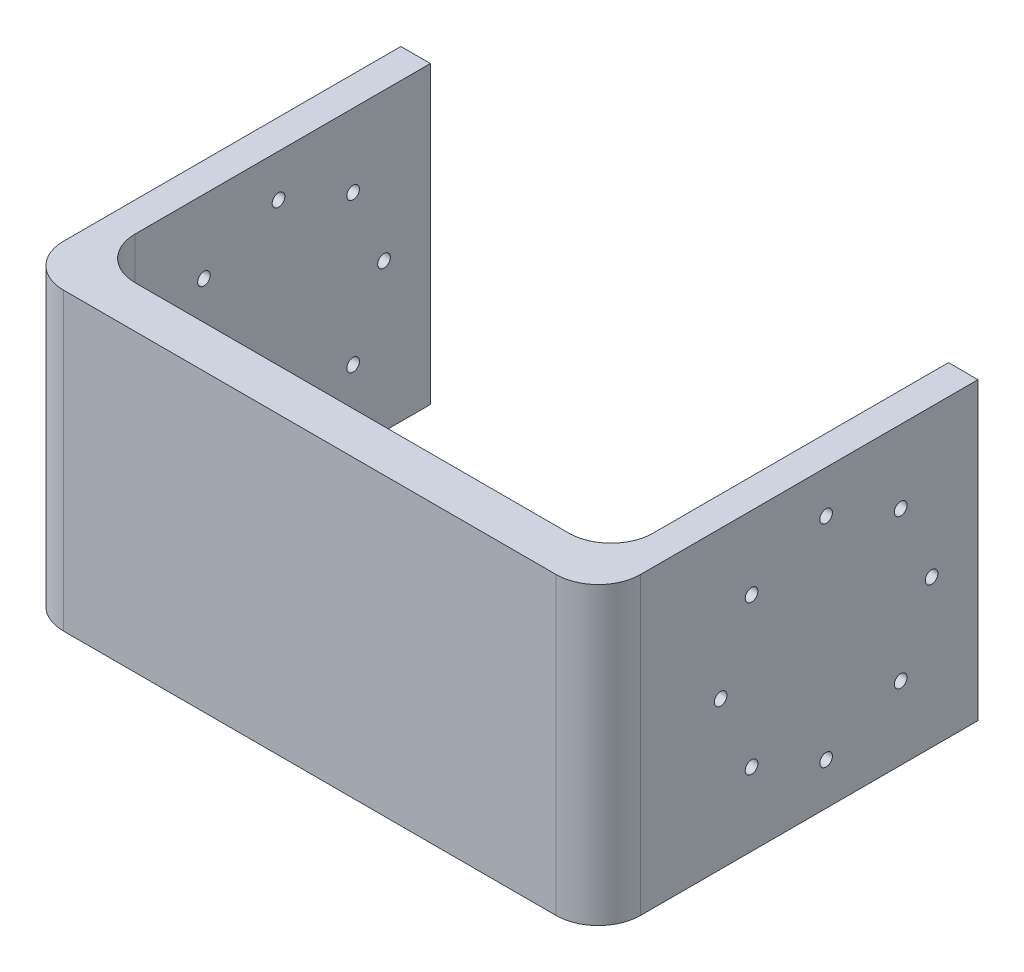
ISO-10303-21;
HEADER;
FILE_DESCRIPTION(('STEP AP214'),'2;1');
FILE_NAME('part.step','',(''),(''),'','','');
FILE_SCHEMA(('AUTOMOTIVE_DESIGN { 1 0 10303 214 1 1 1 1 }'));
ENDSEC;
DATA;
#1=APPLICATION_CONTEXT('core data for automotive mechanical design processes');
#2=APPLICATION_PROTOCOL_DEFINITION('international standard','automotive_design',2000,#1);
#3=PRODUCT_CONTEXT('',#1,'mechanical');
#4=PRODUCT('Part','Part','',(#3));
#5=PRODUCT_RELATED_PRODUCT_CATEGORY('part','',(#4));
#6=PRODUCT_DEFINITION_FORMATION('','',#4);
#7=PRODUCT_DEFINITION_CONTEXT('part definition',#1,'design');
#8=PRODUCT_DEFINITION('design','',#6,#7);
#9=PRODUCT_DEFINITION_SHAPE('','',#8);
#10=(LENGTH_UNIT() NAMED_UNIT(*) SI_UNIT(.MILLI.,.METRE.));
#11=(NAMED_UNIT(*) PLANE_ANGLE_UNIT() SI_UNIT($,.RADIAN.));
#12=(NAMED_UNIT(*) SI_UNIT($,.STERADIAN.) SOLID_ANGLE_UNIT());
#13=UNCERTAINTY_MEASURE_WITH_UNIT(LENGTH_MEASURE(1.E-05),#10,'distance_accuracy_value','');
#14=(GEOMETRIC_REPRESENTATION_CONTEXT(3) GLOBAL_UNCERTAINTY_ASSIGNED_CONTEXT((#13)) GLOBAL_UNIT_ASSIGNED_CONTEXT((#10,
#11,#12)) REPRESENTATION_CONTEXT('',''));
#15=CARTESIAN_POINT('',(0.,0.,0.));
#16=DIRECTION('',(0.,0.,1.));
#17=DIRECTION('',(1.,0.,0.));
#18=AXIS2_PLACEMENT_3D('',#15,#16,#17);
#19=CARTESIAN_POINT('',(34.2,17.5,-45.));
#20=DIRECTION('',(0.,0.,1.));
#21=DIRECTION('',(1.,0.,0.));
#22=AXIS2_PLACEMENT_3D('',#19,#20,#21);
#23=PLANE('',#22);
#24=DIRECTION('',(-1.,0.,0.));
#25=VECTOR('',#24,1.);
#26=CARTESIAN_POINT('',(34.2,-17.5,-45.));
#27=LINE('',#26,#25);
#28=CARTESIAN_POINT('',(34.2,-17.5,-45.));
#29=VERTEX_POINT('',#28);
#30=CARTESIAN_POINT('',(30.7,-17.5,-45.));
#31=VERTEX_POINT('',#30);
#32=EDGE_CURVE('E162',#29,#31,#27,.T.);
#33=ORIENTED_EDGE('',*,*,#32,.T.);
#34=DIRECTION('',(0.,-1.,0.));
#35=VECTOR('',#34,1.);
#36=CARTESIAN_POINT('',(30.7,17.5,-45.));
#37=LINE('',#36,#35);
#38=CARTESIAN_POINT('',(30.7,17.5,-45.));
#39=VERTEX_POINT('',#38);
#40=EDGE_CURVE('E12',#39,#31,#37,.T.);
#41=ORIENTED_EDGE('',*,*,#40,.F.);
#42=DIRECTION('',(-1.,0.,0.));
#43=VECTOR('',#42,1.);
#44=CARTESIAN_POINT('',(34.2,17.5,-45.));
#45=LINE('',#44,#43);
#46=CARTESIAN_POINT('',(34.2,17.5,-45.));
#47=VERTEX_POINT('',#46);
#48=EDGE_CURVE('E185',#47,#39,#45,.T.);
#49=ORIENTED_EDGE('',*,*,#48,.F.);
#50=DIRECTION('',(0.,-1.,0.));
#51=VECTOR('',#50,1.);
#52=CARTESIAN_POINT('',(34.2,17.5,-45.));
#53=LINE('',#52,#51);
#54=EDGE_CURVE('E158',#47,#29,#53,.T.);
#55=ORIENTED_EDGE('',*,*,#54,.T.);
#56=EDGE_LOOP('',(#33,#41,#49,#55));
#57=FACE_BOUND('',#56,.T.);
#58=ADVANCED_FACE('F42',(#57),#23,.F.);
#59=CARTESIAN_POINT('',(30.7,17.5,-10.));
#60=DIRECTION('',(1.,0.,0.));
#61=DIRECTION('',(0.,0.,-1.));
#62=AXIS2_PLACEMENT_3D('',#59,#60,#61);
#63=PLANE('',#62);
#64=CARTESIAN_POINT('',(30.7,-12.5,-27.));
#65=DIRECTION('',(1.,0.,0.));
#66=DIRECTION('',(0.,0.,-1.));
#67=AXIS2_PLACEMENT_3D('',#64,#65,#66);
#68=CIRCLE('',#67,0.750000000000002);
#69=CARTESIAN_POINT('',(30.7,-12.5,-27.75));
#70=VERTEX_POINT('',#69);
#71=EDGE_CURVE('E507',#70,#70,#68,.T.);
#72=ORIENTED_EDGE('',*,*,#71,.T.);
#73=EDGE_LOOP('',(#72));
#74=FACE_BOUND('',#73,.T.);
#75=CARTESIAN_POINT('',(30.7,12.5,-27.));
#76=DIRECTION('',(1.,0.,0.));
#77=DIRECTION('',(0.,0.,-1.));
#78=AXIS2_PLACEMENT_3D('',#75,#76,#77);
#79=CIRCLE('',#78,0.749999999999998);
#80=CARTESIAN_POINT('',(30.7,12.5,-27.75));
#81=VERTEX_POINT('',#80);
#82=EDGE_CURVE('E583',#81,#81,#79,.T.);
#83=ORIENTED_EDGE('',*,*,#82,.T.);
#84=EDGE_LOOP('',(#83));
#85=FACE_BOUND('',#84,.T.);
#86=CARTESIAN_POINT('',(30.7,8.83883476483184,-35.8388347648318));
#87=DIRECTION('',(1.,0.,0.));
#88=DIRECTION('',(0.,0.,-1.));
#89=AXIS2_PLACEMENT_3D('',#86,#87,#88);
#90=CIRCLE('',#89,0.749999999999999);
#91=CARTESIAN_POINT('',(30.7,8.83883476483184,-36.5888347648318));
#92=VERTEX_POINT('',#91);
#93=EDGE_CURVE('E577',#92,#92,#90,.T.);
#94=ORIENTED_EDGE('',*,*,#93,.T.);
#95=EDGE_LOOP('',(#94));
#96=FACE_BOUND('',#95,.T.);
#97=CARTESIAN_POINT('',(30.7,0.,-39.5));
#98=DIRECTION('',(1.,0.,0.));
#99=DIRECTION('',(0.,0.,-1.));
#100=AXIS2_PLACEMENT_3D('',#97,#98,#99);
#101=CIRCLE('',#100,0.749999999999999);
#102=CARTESIAN_POINT('',(30.7,0.,-40.25));
#103=VERTEX_POINT('',#102);
#104=EDGE_CURVE('E571',#103,#103,#101,.T.);
#105=ORIENTED_EDGE('',*,*,#104,.T.);
#106=EDGE_LOOP('',(#105));
#107=FACE_BOUND('',#106,.T.);
#108=CARTESIAN_POINT('',(30.7,-8.83883476483184,-35.8388347648318));
#109=DIRECTION('',(1.,0.,0.));
#110=DIRECTION('',(0.,0.,-1.));
#111=AXIS2_PLACEMENT_3D('',#108,#109,#110);
#112=CIRCLE('',#111,0.749999999999999);
#113=CARTESIAN_POINT('',(30.7,-8.83883476483184,-36.5888347648318));
#114=VERTEX_POINT('',#113);
#115=EDGE_CURVE('E565',#114,#114,#112,.T.);
#116=ORIENTED_EDGE('',*,*,#115,.T.);
#117=EDGE_LOOP('',(#116));
#118=FACE_BOUND('',#117,.T.);
#119=CARTESIAN_POINT('',(30.7,-8.83883476483185,-18.1611652351682));
#120=DIRECTION('',(1.,0.,0.));
#121=DIRECTION('',(0.,0.,-1.));
#122=AXIS2_PLACEMENT_3D('',#119,#120,#121);
#123=CIRCLE('',#122,0.749999999999998);
#124=CARTESIAN_POINT('',(30.7,-8.83883476483185,-18.9111652351682));
#125=VERTEX_POINT('',#124);
#126=EDGE_CURVE('E559',#125,#125,#123,.T.);
#127=ORIENTED_EDGE('',*,*,#126,.T.);
#128=EDGE_LOOP('',(#127));
#129=FACE_BOUND('',#128,.T.);
#130=CARTESIAN_POINT('',(30.7,0.,-14.5));
#131=DIRECTION('',(1.,0.,0.));
#132=DIRECTION('',(0.,0.,-1.));
#133=AXIS2_PLACEMENT_3D('',#130,#131,#132);
#134=CIRCLE('',#133,0.750000000000002);
#135=CARTESIAN_POINT('',(30.7,0.,-15.25));
#136=VERTEX_POINT('',#135);
#137=EDGE_CURVE('E553',#136,#136,#134,.T.);
#138=ORIENTED_EDGE('',*,*,#137,.T.);
#139=EDGE_LOOP('',(#138));
#140=FACE_BOUND('',#139,.T.);
#141=CARTESIAN_POINT('',(30.7,8.83883476483184,-18.1611652351681));
#142=DIRECTION('',(1.,0.,0.));
#143=DIRECTION('',(0.,0.,-1.));
#144=AXIS2_PLACEMENT_3D('',#141,#142,#143);
#145=CIRCLE('',#144,0.750000000000005);
#146=CARTESIAN_POINT('',(30.7,8.83883476483184,-18.9111652351682));
#147=VERTEX_POINT('',#146);
#148=EDGE_CURVE('E166',#147,#147,#145,.T.);
#149=ORIENTED_EDGE('',*,*,#148,.T.);
#150=EDGE_LOOP('',(#149));
#151=FACE_BOUND('',#150,.T.);
#152=DIRECTION('',(0.,0.,1.));
#153=VECTOR('',#152,1.);
#154=CARTESIAN_POINT('',(30.7,-17.5,-10.));
#155=LINE('',#154,#153);
#156=CARTESIAN_POINT('',(30.7,-17.5,-10.));
#157=VERTEX_POINT('',#156);
#158=EDGE_CURVE('E165',#31,#157,#155,.T.);
#159=ORIENTED_EDGE('',*,*,#158,.T.);
#160=DIRECTION('',(0.,-1.,0.));
#161=VECTOR('',#160,1.);
#162=CARTESIAN_POINT('',(30.7,17.5,-10.));
#163=LINE('',#162,#161);
#164=CARTESIAN_POINT('',(30.7,17.5,-10.));
#165=VERTEX_POINT('',#164);
#166=EDGE_CURVE('E50',#165,#157,#163,.T.);
#167=ORIENTED_EDGE('',*,*,#166,.F.);
#168=DIRECTION('',(0.,0.,1.));
#169=VECTOR('',#168,1.);
#170=CARTESIAN_POINT('',(30.7,17.5,-10.));
#171=LINE('',#170,#169);
#172=EDGE_CURVE('E113',#39,#165,#171,.T.);
#173=ORIENTED_EDGE('',*,*,#172,.F.);
#174=ORIENTED_EDGE('',*,*,#40,.T.);
#175=EDGE_LOOP('',(#159,#167,#173,#174));
#176=FACE_BOUND('',#175,.T.);
#177=ADVANCED_FACE('F266',(#74,#85,#96,#107,#118,#129,#140,#151,#176),#63,.F.);
#178=CARTESIAN_POINT('',(25.7,17.5,-10.));
#179=DIRECTION('',(0.,-1.,0.));
#180=DIRECTION('',(0.,0.,-1.));
#181=AXIS2_PLACEMENT_3D('',#178,#179,#180);
#182=CYLINDRICAL_SURFACE('',#181,5.);
#183=CARTESIAN_POINT('',(25.7,-17.5,-10.));
#184=DIRECTION('',(0.,-1.,0.));
#185=DIRECTION('',(0.,0.,1.));
#186=AXIS2_PLACEMENT_3D('',#183,#184,#185);
#187=CIRCLE('',#186,5.);
#188=CARTESIAN_POINT('',(25.7,-17.5,-5.));
#189=VERTEX_POINT('',#188);
#190=EDGE_CURVE('E168',#157,#189,#187,.T.);
#191=ORIENTED_EDGE('',*,*,#190,.T.);
#192=DIRECTION('',(0.,-1.,0.));
#193=VECTOR('',#192,1.);
#194=CARTESIAN_POINT('',(25.7,17.5,-5.));
#195=LINE('',#194,#193);
#196=CARTESIAN_POINT('',(25.7,17.5,-5.));
#197=VERTEX_POINT('',#196);
#198=EDGE_CURVE('E204',#197,#189,#195,.T.);
#199=ORIENTED_EDGE('',*,*,#198,.F.);
#200=CARTESIAN_POINT('',(25.7,17.5,-10.));
#201=DIRECTION('',(0.,-1.,0.));
#202=DIRECTION('',(0.,0.,1.));
#203=AXIS2_PLACEMENT_3D('',#200,#201,#202);
#204=CIRCLE('',#203,5.);
#205=EDGE_CURVE('E212',#165,#197,#204,.T.);
#206=ORIENTED_EDGE('',*,*,#205,.F.);
#207=ORIENTED_EDGE('',*,*,#166,.T.);
#208=EDGE_LOOP('',(#191,#199,#206,#207));
#209=FACE_BOUND('',#208,.T.);
#210=ADVANCED_FACE('F210',(#209),#182,.F.);
#211=CARTESIAN_POINT('',(-25.7,17.5,-5.));
#212=DIRECTION('',(0.,0.,1.));
#213=DIRECTION('',(1.,0.,0.));
#214=AXIS2_PLACEMENT_3D('',#211,#212,#213);
#215=PLANE('',#214);
#216=DIRECTION('',(-1.,0.,0.));
#217=VECTOR('',#216,1.);
#218=CARTESIAN_POINT('',(-25.7,-17.5,-5.));
#219=LINE('',#218,#217);
#220=CARTESIAN_POINT('',(-25.7,-17.5,-5.));
#221=VERTEX_POINT('',#220);
#222=EDGE_CURVE('E170',#189,#221,#219,.T.);
#223=ORIENTED_EDGE('',*,*,#222,.T.);
#224=DIRECTION('',(0.,-1.,0.));
#225=VECTOR('',#224,1.);
#226=CARTESIAN_POINT('',(-25.7,17.5,-5.));
#227=LINE('',#226,#225);
#228=CARTESIAN_POINT('',(-25.7,17.5,-5.));
#229=VERTEX_POINT('',#228);
#230=EDGE_CURVE('E201',#229,#221,#227,.T.);
#231=ORIENTED_EDGE('',*,*,#230,.F.);
#232=DIRECTION('',(-1.,0.,0.));
#233=VECTOR('',#232,1.);
#234=CARTESIAN_POINT('',(-25.7,17.5,-5.));
#235=LINE('',#234,#233);
#236=EDGE_CURVE('E230',#197,#229,#235,.T.);
#237=ORIENTED_EDGE('',*,*,#236,.F.);
#238=ORIENTED_EDGE('',*,*,#198,.T.);
#239=EDGE_LOOP('',(#223,#231,#237,#238));
#240=FACE_BOUND('',#239,.T.);
#241=ADVANCED_FACE('F221',(#240),#215,.F.);
#242=CARTESIAN_POINT('',(-25.7,17.5,-10.));
#243=DIRECTION('',(0.,-1.,0.));
#244=DIRECTION('',(0.,0.,-1.));
#245=AXIS2_PLACEMENT_3D('',#242,#243,#244);
#246=CYLINDRICAL_SURFACE('',#245,5.);
#247=CARTESIAN_POINT('',(-25.7,-17.5,-10.));
#248=DIRECTION('',(0.,-1.,0.));
#249=DIRECTION('',(0.,0.,1.));
#250=AXIS2_PLACEMENT_3D('',#247,#248,#249);
#251=CIRCLE('',#250,5.);
#252=CARTESIAN_POINT('',(-30.7,-17.5,-10.));
#253=VERTEX_POINT('',#252);
#254=EDGE_CURVE('E172',#221,#253,#251,.T.);
#255=ORIENTED_EDGE('',*,*,#254,.T.);
#256=DIRECTION('',(0.,-1.,0.));
#257=VECTOR('',#256,1.);
#258=CARTESIAN_POINT('',(-30.7,17.5,-10.));
#259=LINE('',#258,#257);
#260=CARTESIAN_POINT('',(-30.7,17.5,-10.));
#261=VERTEX_POINT('',#260);
#262=EDGE_CURVE('E198',#261,#253,#259,.T.);
#263=ORIENTED_EDGE('',*,*,#262,.F.);
#264=CARTESIAN_POINT('',(-25.7,17.5,-10.));
#265=DIRECTION('',(0.,-1.,0.));
#266=DIRECTION('',(0.,0.,1.));
#267=AXIS2_PLACEMENT_3D('',#264,#265,#266);
#268=CIRCLE('',#267,5.);
#269=EDGE_CURVE('E227',#229,#261,#268,.T.);
#270=ORIENTED_EDGE('',*,*,#269,.F.);
#271=ORIENTED_EDGE('',*,*,#230,.T.);
#272=EDGE_LOOP('',(#255,#263,#270,#271));
#273=FACE_BOUND('',#272,.T.);
#274=ADVANCED_FACE('F225',(#273),#246,.F.);
#275=CARTESIAN_POINT('',(-30.7,17.5,-45.));
#276=DIRECTION('',(-1.,0.,0.));
#277=DIRECTION('',(0.,0.,1.));
#278=AXIS2_PLACEMENT_3D('',#275,#276,#277);
#279=PLANE('',#278);
#280=CARTESIAN_POINT('',(-30.7,-12.5,-27.));
#281=DIRECTION('',(-1.,0.,0.));
#282=DIRECTION('',(0.,0.,1.));
#283=AXIS2_PLACEMENT_3D('',#280,#281,#282);
#284=CIRCLE('',#283,0.750000000000002);
#285=CARTESIAN_POINT('',(-30.7,-12.5,-26.25));
#286=VERTEX_POINT('',#285);
#287=EDGE_CURVE('E506',#286,#286,#284,.T.);
#288=ORIENTED_EDGE('',*,*,#287,.T.);
#289=EDGE_LOOP('',(#288));
#290=FACE_BOUND('',#289,.T.);
#291=CARTESIAN_POINT('',(-30.7,12.5,-27.));
#292=DIRECTION('',(-1.,0.,0.));
#293=DIRECTION('',(0.,0.,1.));
#294=AXIS2_PLACEMENT_3D('',#291,#292,#293);
#295=CIRCLE('',#294,0.749999999999998);
#296=CARTESIAN_POINT('',(-30.7,12.5,-26.25));
#297=VERTEX_POINT('',#296);
#298=EDGE_CURVE('E580',#297,#297,#295,.T.);
#299=ORIENTED_EDGE('',*,*,#298,.T.);
#300=EDGE_LOOP('',(#299));
#301=FACE_BOUND('',#300,.T.);
#302=CARTESIAN_POINT('',(-30.7,8.83883476483184,-35.8388347648318));
#303=DIRECTION('',(-1.,0.,0.));
#304=DIRECTION('',(0.,0.,1.));
#305=AXIS2_PLACEMENT_3D('',#302,#303,#304);
#306=CIRCLE('',#305,0.749999999999999);
#307=CARTESIAN_POINT('',(-30.7,8.83883476483184,-35.0888347648318));
#308=VERTEX_POINT('',#307);
#309=EDGE_CURVE('E574',#308,#308,#306,.T.);
#310=ORIENTED_EDGE('',*,*,#309,.T.);
#311=EDGE_LOOP('',(#310));
#312=FACE_BOUND('',#311,.T.);
#313=CARTESIAN_POINT('',(-30.7,0.,-39.5));
#314=DIRECTION('',(-1.,0.,0.));
#315=DIRECTION('',(0.,0.,1.));
#316=AXIS2_PLACEMENT_3D('',#313,#314,#315);
#317=CIRCLE('',#316,0.749999999999999);
#318=CARTESIAN_POINT('',(-30.7,0.,-38.75));
#319=VERTEX_POINT('',#318);
#320=EDGE_CURVE('E568',#319,#319,#317,.T.);
#321=ORIENTED_EDGE('',*,*,#320,.T.);
#322=EDGE_LOOP('',(#321));
#323=FACE_BOUND('',#322,.T.);
#324=CARTESIAN_POINT('',(-30.7,-8.83883476483184,-35.8388347648318));
#325=DIRECTION('',(-1.,0.,0.));
#326=DIRECTION('',(0.,0.,1.));
#327=AXIS2_PLACEMENT_3D('',#324,#325,#326);
#328=CIRCLE('',#327,0.749999999999999);
#329=CARTESIAN_POINT('',(-30.7,-8.83883476483184,-35.0888347648318));
#330=VERTEX_POINT('',#329);
#331=EDGE_CURVE('E562',#330,#330,#328,.T.);
#332=ORIENTED_EDGE('',*,*,#331,.T.);
#333=EDGE_LOOP('',(#332));
#334=FACE_BOUND('',#333,.T.);
#335=CARTESIAN_POINT('',(-30.7,-8.83883476483185,-18.1611652351682));
#336=DIRECTION('',(-1.,0.,0.));
#337=DIRECTION('',(0.,0.,1.));
#338=AXIS2_PLACEMENT_3D('',#335,#336,#337);
#339=CIRCLE('',#338,0.749999999999998);
#340=CARTESIAN_POINT('',(-30.7,-8.83883476483185,-17.4111652351682));
#341=VERTEX_POINT('',#340);
#342=EDGE_CURVE('E556',#341,#341,#339,.T.);
#343=ORIENTED_EDGE('',*,*,#342,.T.);
#344=EDGE_LOOP('',(#343));
#345=FACE_BOUND('',#344,.T.);
#346=CARTESIAN_POINT('',(-30.7,0.,-14.5));
#347=DIRECTION('',(-1.,0.,0.));
#348=DIRECTION('',(0.,0.,1.));
#349=AXIS2_PLACEMENT_3D('',#346,#347,#348);
#350=CIRCLE('',#349,0.750000000000002);
#351=CARTESIAN_POINT('',(-30.7,0.,-13.75));
#352=VERTEX_POINT('',#351);
#353=EDGE_CURVE('E540',#352,#352,#350,.T.);
#354=ORIENTED_EDGE('',*,*,#353,.T.);
#355=EDGE_LOOP('',(#354));
#356=FACE_BOUND('',#355,.T.);
#357=CARTESIAN_POINT('',(-30.7,8.83883476483184,-18.1611652351681));
#358=DIRECTION('',(-1.,0.,0.));
#359=DIRECTION('',(0.,0.,1.));
#360=AXIS2_PLACEMENT_3D('',#357,#358,#359);
#361=CIRCLE('',#360,0.750000000000005);
#362=CARTESIAN_POINT('',(-30.7,8.83883476483184,-17.4111652351681));
#363=VERTEX_POINT('',#362);
#364=EDGE_CURVE('E592',#363,#363,#361,.T.);
#365=ORIENTED_EDGE('',*,*,#364,.T.);
#366=EDGE_LOOP('',(#365));
#367=FACE_BOUND('',#366,.T.);
#368=DIRECTION('',(0.,0.,-1.));
#369=VECTOR('',#368,1.);
#370=CARTESIAN_POINT('',(-30.7,-17.5,-45.));
#371=LINE('',#370,#369);
#372=CARTESIAN_POINT('',(-30.7,-17.5,-45.));
#373=VERTEX_POINT('',#372);
#374=EDGE_CURVE('E174',#253,#373,#371,.T.);
#375=ORIENTED_EDGE('',*,*,#374,.T.);
#376=DIRECTION('',(0.,-1.,0.));
#377=VECTOR('',#376,1.);
#378=CARTESIAN_POINT('',(-30.7,17.5,-45.));
#379=LINE('',#378,#377);
#380=CARTESIAN_POINT('',(-30.7,17.5,-45.));
#381=VERTEX_POINT('',#380);
#382=EDGE_CURVE('E195',#381,#373,#379,.T.);
#383=ORIENTED_EDGE('',*,*,#382,.F.);
#384=DIRECTION('',(0.,0.,-1.));
#385=VECTOR('',#384,1.);
#386=CARTESIAN_POINT('',(-30.7,17.5,-45.));
#387=LINE('',#386,#385);
#388=EDGE_CURVE('E229',#261,#381,#387,.T.);
#389=ORIENTED_EDGE('',*,*,#388,.F.);
#390=ORIENTED_EDGE('',*,*,#262,.T.);
#391=EDGE_LOOP('',(#375,#383,#389,#390));
#392=FACE_BOUND('',#391,.T.);
#393=ADVANCED_FACE('F282',(#290,#301,#312,#323,#334,#345,#356,#367,#392),#279,.F.);
#394=CARTESIAN_POINT('',(-30.7,17.5,-45.));
#395=DIRECTION('',(0.,0.,1.));
#396=DIRECTION('',(1.,0.,0.));
#397=AXIS2_PLACEMENT_3D('',#394,#395,#396);
#398=PLANE('',#397);
#399=DIRECTION('',(-1.,0.,0.));
#400=VECTOR('',#399,1.);
#401=CARTESIAN_POINT('',(-30.7,-17.5,-45.));
#402=LINE('',#401,#400);
#403=CARTESIAN_POINT('',(-34.2,-17.5,-45.));
#404=VERTEX_POINT('',#403);
#405=EDGE_CURVE('E176',#373,#404,#402,.T.);
#406=ORIENTED_EDGE('',*,*,#405,.T.);
#407=DIRECTION('',(0.,-1.,0.));
#408=VECTOR('',#407,1.);
#409=CARTESIAN_POINT('',(-34.2,17.5,-45.));
#410=LINE('',#409,#408);
#411=CARTESIAN_POINT('',(-34.2,17.5,-45.));
#412=VERTEX_POINT('',#411);
#413=EDGE_CURVE('E192',#412,#404,#410,.T.);
#414=ORIENTED_EDGE('',*,*,#413,.F.);
#415=DIRECTION('',(-1.,0.,0.));
#416=VECTOR('',#415,1.);
#417=CARTESIAN_POINT('',(-30.7,17.5,-45.));
#418=LINE('',#417,#416);
#419=EDGE_CURVE('E232',#381,#412,#418,.T.);
#420=ORIENTED_EDGE('',*,*,#419,.F.);
#421=ORIENTED_EDGE('',*,*,#382,.T.);
#422=EDGE_LOOP('',(#406,#414,#420,#421));
#423=FACE_BOUND('',#422,.T.);
#424=ADVANCED_FACE('F285',(#423),#398,.F.);
#425=CARTESIAN_POINT('',(-34.2,17.5,-45.));
#426=DIRECTION('',(1.,0.,0.));
#427=DIRECTION('',(0.,0.,-1.));
#428=AXIS2_PLACEMENT_3D('',#425,#426,#427);
#429=PLANE('',#428);
#430=CARTESIAN_POINT('',(-34.2,-12.5,-27.));
#431=DIRECTION('',(-1.,0.,0.));
#432=DIRECTION('',(0.,0.,1.));
#433=AXIS2_PLACEMENT_3D('',#430,#431,#432);
#434=CIRCLE('',#433,0.750000000000002);
#435=CARTESIAN_POINT('',(-34.2,-12.5,-26.25));
#436=VERTEX_POINT('',#435);
#437=EDGE_CURVE('E503',#436,#436,#434,.T.);
#438=ORIENTED_EDGE('',*,*,#437,.F.);
#439=EDGE_LOOP('',(#438));
#440=FACE_BOUND('',#439,.T.);
#441=CARTESIAN_POINT('',(-34.2,12.5,-27.));
#442=DIRECTION('',(-1.,0.,0.));
#443=DIRECTION('',(0.,0.,1.));
#444=AXIS2_PLACEMENT_3D('',#441,#442,#443);
#445=CIRCLE('',#444,0.749999999999998);
#446=CARTESIAN_POINT('',(-34.2,12.5,-26.25));
#447=VERTEX_POINT('',#446);
#448=EDGE_CURVE('E526',#447,#447,#445,.T.);
#449=ORIENTED_EDGE('',*,*,#448,.F.);
#450=EDGE_LOOP('',(#449));
#451=FACE_BOUND('',#450,.T.);
#452=CARTESIAN_POINT('',(-34.2,8.83883476483184,-35.8388347648318));
#453=DIRECTION('',(-1.,0.,0.));
#454=DIRECTION('',(0.,0.,1.));
#455=AXIS2_PLACEMENT_3D('',#452,#453,#454);
#456=CIRCLE('',#455,0.749999999999999);
#457=CARTESIAN_POINT('',(-34.2,8.83883476483184,-35.0888347648318));
#458=VERTEX_POINT('',#457);
#459=EDGE_CURVE('E519',#458,#458,#456,.T.);
#460=ORIENTED_EDGE('',*,*,#459,.F.);
#461=EDGE_LOOP('',(#460));
#462=FACE_BOUND('',#461,.T.);
#463=CARTESIAN_POINT('',(-34.2,0.,-39.5));
#464=DIRECTION('',(-1.,0.,0.));
#465=DIRECTION('',(0.,0.,1.));
#466=AXIS2_PLACEMENT_3D('',#463,#464,#465);
#467=CIRCLE('',#466,0.749999999999999);
#468=CARTESIAN_POINT('',(-34.2,0.,-38.75));
#469=VERTEX_POINT('',#468);
#470=EDGE_CURVE('E518',#469,#469,#467,.T.);
#471=ORIENTED_EDGE('',*,*,#470,.F.);
#472=EDGE_LOOP('',(#471));
#473=FACE_BOUND('',#472,.T.);
#474=CARTESIAN_POINT('',(-34.2,-8.83883476483184,-35.8388347648318));
#475=DIRECTION('',(-1.,0.,0.));
#476=DIRECTION('',(0.,0.,1.));
#477=AXIS2_PLACEMENT_3D('',#474,#475,#476);
#478=CIRCLE('',#477,0.749999999999999);
#479=CARTESIAN_POINT('',(-34.2,-8.83883476483184,-35.0888347648318));
#480=VERTEX_POINT('',#479);
#481=EDGE_CURVE('E544',#480,#480,#478,.T.);
#482=ORIENTED_EDGE('',*,*,#481,.F.);
#483=EDGE_LOOP('',(#482));
#484=FACE_BOUND('',#483,.T.);
#485=CARTESIAN_POINT('',(-34.2,-8.83883476483185,-18.1611652351682));
#486=DIRECTION('',(-1.,0.,0.));
#487=DIRECTION('',(0.,0.,1.));
#488=AXIS2_PLACEMENT_3D('',#485,#486,#487);
#489=CIRCLE('',#488,0.749999999999998);
#490=CARTESIAN_POINT('',(-34.2,-8.83883476483185,-17.4111652351682));
#491=VERTEX_POINT('',#490);
#492=EDGE_CURVE('E537',#491,#491,#489,.T.);
#493=ORIENTED_EDGE('',*,*,#492,.F.);
#494=EDGE_LOOP('',(#493));
#495=FACE_BOUND('',#494,.T.);
#496=CARTESIAN_POINT('',(-34.2,0.,-14.5));
#497=DIRECTION('',(-1.,0.,0.));
#498=DIRECTION('',(0.,0.,1.));
#499=AXIS2_PLACEMENT_3D('',#496,#497,#498);
#500=CIRCLE('',#499,0.750000000000002);
#501=CARTESIAN_POINT('',(-34.2,0.,-13.75));
#502=VERTEX_POINT('',#501);
#503=EDGE_CURVE('E536',#502,#502,#500,.T.);
#504=ORIENTED_EDGE('',*,*,#503,.F.);
#505=EDGE_LOOP('',(#504));
#506=FACE_BOUND('',#505,.T.);
#507=CARTESIAN_POINT('',(-34.2,8.83883476483184,-18.1611652351681));
#508=DIRECTION('',(-1.,0.,0.));
#509=DIRECTION('',(0.,0.,1.));
#510=AXIS2_PLACEMENT_3D('',#507,#508,#509);
#511=CIRCLE('',#510,0.750000000000005);
#512=CARTESIAN_POINT('',(-34.2,8.83883476483184,-17.4111652351681));
#513=VERTEX_POINT('',#512);
#514=EDGE_CURVE('E586',#513,#513,#511,.T.);
#515=ORIENTED_EDGE('',*,*,#514,.F.);
#516=EDGE_LOOP('',(#515));
#517=FACE_BOUND('',#516,.T.);
#518=DIRECTION('',(0.,0.,1.));
#519=VECTOR('',#518,1.);
#520=CARTESIAN_POINT('',(-34.2,-17.5,-45.));
#521=LINE('',#520,#519);
#522=CARTESIAN_POINT('',(-34.2,-17.5,-5.));
#523=VERTEX_POINT('',#522);
#524=EDGE_CURVE('E178',#404,#523,#521,.T.);
#525=ORIENTED_EDGE('',*,*,#524,.T.);
#526=DIRECTION('',(0.,-1.,0.));
#527=VECTOR('',#526,1.);
#528=CARTESIAN_POINT('',(-34.2,17.5,-5.));
#529=LINE('',#528,#527);
#530=CARTESIAN_POINT('',(-34.2,17.5,-5.));
#531=VERTEX_POINT('',#530);
#532=EDGE_CURVE('E189',#531,#523,#529,.T.);
#533=ORIENTED_EDGE('',*,*,#532,.F.);
#534=DIRECTION('',(0.,0.,1.));
#535=VECTOR('',#534,1.);
#536=CARTESIAN_POINT('',(-34.2,17.5,-45.));
#537=LINE('',#536,#535);
#538=EDGE_CURVE('E238',#412,#531,#537,.T.);
#539=ORIENTED_EDGE('',*,*,#538,.F.);
#540=ORIENTED_EDGE('',*,*,#413,.T.);
#541=EDGE_LOOP('',(#525,#533,#539,#540));
#542=FACE_BOUND('',#541,.T.);
#543=ADVANCED_FACE('F244',(#440,#451,#462,#473,#484,#495,#506,#517,#542),#429,.F.);
#544=CARTESIAN_POINT('',(-29.2,17.5,-5.));
#545=DIRECTION('',(0.,-1.,0.));
#546=DIRECTION('',(0.,0.,-1.));
#547=AXIS2_PLACEMENT_3D('',#544,#545,#546);
#548=CYLINDRICAL_SURFACE('',#547,5.);
#549=CARTESIAN_POINT('',(-29.2,-17.5,-5.));
#550=DIRECTION('',(0.,1.,0.));
#551=DIRECTION('',(0.,0.,1.));
#552=AXIS2_PLACEMENT_3D('',#549,#550,#551);
#553=CIRCLE('',#552,5.);
#554=CARTESIAN_POINT('',(-29.2,-17.5,0.));
#555=VERTEX_POINT('',#554);
#556=EDGE_CURVE('E180',#523,#555,#553,.T.);
#557=ORIENTED_EDGE('',*,*,#556,.T.);
#558=DIRECTION('',(0.,-1.,0.));
#559=VECTOR('',#558,1.);
#560=CARTESIAN_POINT('',(-29.2,17.5,0.));
#561=LINE('',#560,#559);
#562=CARTESIAN_POINT('',(-29.2,17.5,0.));
#563=VERTEX_POINT('',#562);
#564=EDGE_CURVE('E153',#563,#555,#561,.T.);
#565=ORIENTED_EDGE('',*,*,#564,.F.);
#566=CARTESIAN_POINT('',(-29.2,17.5,-5.));
#567=DIRECTION('',(0.,1.,0.));
#568=DIRECTION('',(0.,0.,1.));
#569=AXIS2_PLACEMENT_3D('',#566,#567,#568);
#570=CIRCLE('',#569,5.);
#571=EDGE_CURVE('E144',#531,#563,#570,.T.);
#572=ORIENTED_EDGE('',*,*,#571,.F.);
#573=ORIENTED_EDGE('',*,*,#532,.T.);
#574=EDGE_LOOP('',(#557,#565,#572,#573));
#575=FACE_BOUND('',#574,.T.);
#576=ADVANCED_FACE('F248',(#575),#548,.T.);
#577=CARTESIAN_POINT('',(-29.2,17.5,0.));
#578=DIRECTION('',(0.,0.,-1.));
#579=DIRECTION('',(-1.,0.,0.));
#580=AXIS2_PLACEMENT_3D('',#577,#578,#579);
#581=PLANE('',#580);
#582=DIRECTION('',(1.,0.,0.));
#583=VECTOR('',#582,1.);
#584=CARTESIAN_POINT('',(-29.2,-17.5,0.));
#585=LINE('',#584,#583);
#586=CARTESIAN_POINT('',(29.2,-17.5,0.));
#587=VERTEX_POINT('',#586);
#588=EDGE_CURVE('E152',#555,#587,#585,.T.);
#589=ORIENTED_EDGE('',*,*,#588,.T.);
#590=DIRECTION('',(0.,-1.,0.));
#591=VECTOR('',#590,1.);
#592=CARTESIAN_POINT('',(29.2,17.5,0.));
#593=LINE('',#592,#591);
#594=CARTESIAN_POINT('',(29.2,17.5,0.));
#595=VERTEX_POINT('',#594);
#596=EDGE_CURVE('E149',#595,#587,#593,.T.);
#597=ORIENTED_EDGE('',*,*,#596,.F.);
#598=DIRECTION('',(1.,0.,0.));
#599=VECTOR('',#598,1.);
#600=CARTESIAN_POINT('',(-29.2,17.5,0.));
#601=LINE('',#600,#599);
#602=EDGE_CURVE('E138',#563,#595,#601,.T.);
#603=ORIENTED_EDGE('',*,*,#602,.F.);
#604=ORIENTED_EDGE('',*,*,#564,.T.);
#605=EDGE_LOOP('',(#589,#597,#603,#604));
#606=FACE_BOUND('',#605,.T.);
#607=ADVANCED_FACE('F150',(#606),#581,.F.);
#608=CARTESIAN_POINT('',(29.2,17.5,-5.));
#609=DIRECTION('',(0.,-1.,0.));
#610=DIRECTION('',(0.,0.,-1.));
#611=AXIS2_PLACEMENT_3D('',#608,#609,#610);
#612=CYLINDRICAL_SURFACE('',#611,5.);
#613=CARTESIAN_POINT('',(29.2,-17.5,-5.));
#614=DIRECTION('',(0.,1.,0.));
#615=DIRECTION('',(0.,0.,1.));
#616=AXIS2_PLACEMENT_3D('',#613,#614,#615);
#617=CIRCLE('',#616,5.);
#618=CARTESIAN_POINT('',(34.2,-17.5,-5.));
#619=VERTEX_POINT('',#618);
#620=EDGE_CURVE('E99',#587,#619,#617,.T.);
#621=ORIENTED_EDGE('',*,*,#620,.T.);
#622=DIRECTION('',(0.,-1.,0.));
#623=VECTOR('',#622,1.);
#624=CARTESIAN_POINT('',(34.2,17.5,-5.));
#625=LINE('',#624,#623);
#626=CARTESIAN_POINT('',(34.2,17.5,-5.));
#627=VERTEX_POINT('',#626);
#628=EDGE_CURVE('E154',#627,#619,#625,.T.);
#629=ORIENTED_EDGE('',*,*,#628,.F.);
#630=CARTESIAN_POINT('',(29.2,17.5,-5.));
#631=DIRECTION('',(0.,1.,0.));
#632=DIRECTION('',(0.,0.,1.));
#633=AXIS2_PLACEMENT_3D('',#630,#631,#632);
#634=CIRCLE('',#633,5.);
#635=EDGE_CURVE('E142',#595,#627,#634,.T.);
#636=ORIENTED_EDGE('',*,*,#635,.F.);
#637=ORIENTED_EDGE('',*,*,#596,.T.);
#638=EDGE_LOOP('',(#621,#629,#636,#637));
#639=FACE_BOUND('',#638,.T.);
#640=ADVANCED_FACE('F156',(#639),#612,.T.);
#641=CARTESIAN_POINT('',(34.2,17.5,-5.));
#642=DIRECTION('',(-1.,0.,0.));
#643=DIRECTION('',(0.,0.,1.));
#644=AXIS2_PLACEMENT_3D('',#641,#642,#643);
#645=PLANE('',#644);
#646=CARTESIAN_POINT('',(34.2,-12.5,-27.));
#647=DIRECTION('',(-1.,0.,0.));
#648=DIRECTION('',(0.,0.,1.));
#649=AXIS2_PLACEMENT_3D('',#646,#647,#648);
#650=CIRCLE('',#649,0.750000000000002);
#651=CARTESIAN_POINT('',(34.2,-12.5,-26.25));
#652=VERTEX_POINT('',#651);
#653=EDGE_CURVE('E508',#652,#652,#650,.T.);
#654=ORIENTED_EDGE('',*,*,#653,.T.);
#655=EDGE_LOOP('',(#654));
#656=FACE_BOUND('',#655,.T.);
#657=CARTESIAN_POINT('',(34.2,12.5,-27.));
#658=DIRECTION('',(-1.,0.,0.));
#659=DIRECTION('',(0.,0.,1.));
#660=AXIS2_PLACEMENT_3D('',#657,#658,#659);
#661=CIRCLE('',#660,0.749999999999998);
#662=CARTESIAN_POINT('',(34.2,12.5,-26.25));
#663=VERTEX_POINT('',#662);
#664=EDGE_CURVE('E510',#663,#663,#661,.F.);
#665=ORIENTED_EDGE('',*,*,#664,.F.);
#666=EDGE_LOOP('',(#665));
#667=FACE_BOUND('',#666,.T.);
#668=CARTESIAN_POINT('',(34.2,8.83883476483184,-35.8388347648318));
#669=DIRECTION('',(-1.,0.,0.));
#670=DIRECTION('',(0.,0.,1.));
#671=AXIS2_PLACEMENT_3D('',#668,#669,#670);
#672=CIRCLE('',#671,0.749999999999999);
#673=CARTESIAN_POINT('',(34.2,8.83883476483184,-35.0888347648318));
#674=VERTEX_POINT('',#673);
#675=EDGE_CURVE('E523',#674,#674,#672,.F.);
#676=ORIENTED_EDGE('',*,*,#675,.F.);
#677=EDGE_LOOP('',(#676));
#678=FACE_BOUND('',#677,.T.);
#679=CARTESIAN_POINT('',(34.2,0.,-39.5));
#680=DIRECTION('',(-1.,0.,0.));
#681=DIRECTION('',(0.,0.,1.));
#682=AXIS2_PLACEMENT_3D('',#679,#680,#681);
#683=CIRCLE('',#682,0.749999999999999);
#684=CARTESIAN_POINT('',(34.2,0.,-38.75));
#685=VERTEX_POINT('',#684);
#686=EDGE_CURVE('E515',#685,#685,#683,.F.);
#687=ORIENTED_EDGE('',*,*,#686,.F.);
#688=EDGE_LOOP('',(#687));
#689=FACE_BOUND('',#688,.T.);
#690=CARTESIAN_POINT('',(34.2,-8.83883476483184,-35.8388347648318));
#691=DIRECTION('',(-1.,0.,0.));
#692=DIRECTION('',(0.,0.,1.));
#693=AXIS2_PLACEMENT_3D('',#690,#691,#692);
#694=CIRCLE('',#693,0.749999999999999);
#695=CARTESIAN_POINT('',(34.2,-8.83883476483184,-35.0888347648318));
#696=VERTEX_POINT('',#695);
#697=EDGE_CURVE('E522',#696,#696,#694,.F.);
#698=ORIENTED_EDGE('',*,*,#697,.F.);
#699=EDGE_LOOP('',(#698));
#700=FACE_BOUND('',#699,.T.);
#701=CARTESIAN_POINT('',(34.2,-8.83883476483185,-18.1611652351682));
#702=DIRECTION('',(-1.,0.,0.));
#703=DIRECTION('',(0.,0.,1.));
#704=AXIS2_PLACEMENT_3D('',#701,#702,#703);
#705=CIRCLE('',#704,0.749999999999998);
#706=CARTESIAN_POINT('',(34.2,-8.83883476483185,-17.4111652351682));
#707=VERTEX_POINT('',#706);
#708=EDGE_CURVE('E541',#707,#707,#705,.F.);
#709=ORIENTED_EDGE('',*,*,#708,.F.);
#710=EDGE_LOOP('',(#709));
#711=FACE_BOUND('',#710,.T.);
#712=CARTESIAN_POINT('',(34.2,0.,-14.5));
#713=DIRECTION('',(-1.,0.,0.));
#714=DIRECTION('',(0.,0.,1.));
#715=AXIS2_PLACEMENT_3D('',#712,#713,#714);
#716=CIRCLE('',#715,0.750000000000002);
#717=CARTESIAN_POINT('',(34.2,0.,-13.75));
#718=VERTEX_POINT('',#717);
#719=EDGE_CURVE('E533',#718,#718,#716,.F.);
#720=ORIENTED_EDGE('',*,*,#719,.F.);
#721=EDGE_LOOP('',(#720));
#722=FACE_BOUND('',#721,.T.);
#723=CARTESIAN_POINT('',(34.2,8.83883476483184,-18.1611652351681));
#724=DIRECTION('',(-1.,0.,0.));
#725=DIRECTION('',(0.,0.,1.));
#726=AXIS2_PLACEMENT_3D('',#723,#724,#725);
#727=CIRCLE('',#726,0.750000000000005);
#728=CARTESIAN_POINT('',(34.2,8.83883476483184,-17.4111652351681));
#729=VERTEX_POINT('',#728);
#730=EDGE_CURVE('E589',#729,#729,#727,.F.);
#731=ORIENTED_EDGE('',*,*,#730,.F.);
#732=EDGE_LOOP('',(#731));
#733=FACE_BOUND('',#732,.T.);
#734=DIRECTION('',(0.,0.,-1.));
#735=VECTOR('',#734,1.);
#736=CARTESIAN_POINT('',(34.2,-17.5,-5.));
#737=LINE('',#736,#735);
#738=EDGE_CURVE('E105',#619,#29,#737,.T.);
#739=ORIENTED_EDGE('',*,*,#738,.T.);
#740=ORIENTED_EDGE('',*,*,#54,.F.);
#741=DIRECTION('',(0.,0.,-1.));
#742=VECTOR('',#741,1.);
#743=CARTESIAN_POINT('',(34.2,17.5,-5.));
#744=LINE('',#743,#742);
#745=EDGE_CURVE('E58',#627,#47,#744,.T.);
#746=ORIENTED_EDGE('',*,*,#745,.F.);
#747=ORIENTED_EDGE('',*,*,#628,.T.);
#748=EDGE_LOOP('',(#739,#740,#746,#747));
#749=FACE_BOUND('',#748,.T.);
#750=ADVANCED_FACE('F252',(#656,#667,#678,#689,#700,#711,#722,#733,#749),#645,.F.);
#751=CARTESIAN_POINT('',(25.7,17.5,-10.));
#752=DIRECTION('',(0.,1.,0.));
#753=DIRECTION('',(0.,0.,1.));
#754=AXIS2_PLACEMENT_3D('',#751,#752,#753);
#755=PLANE('',#754);
#756=ORIENTED_EDGE('',*,*,#48,.T.);
#757=ORIENTED_EDGE('',*,*,#172,.T.);
#758=ORIENTED_EDGE('',*,*,#205,.T.);
#759=ORIENTED_EDGE('',*,*,#236,.T.);
#760=ORIENTED_EDGE('',*,*,#269,.T.);
#761=ORIENTED_EDGE('',*,*,#388,.T.);
#762=ORIENTED_EDGE('',*,*,#419,.T.);
#763=ORIENTED_EDGE('',*,*,#538,.T.);
#764=ORIENTED_EDGE('',*,*,#571,.T.);
#765=ORIENTED_EDGE('',*,*,#602,.T.);
#766=ORIENTED_EDGE('',*,*,#635,.T.);
#767=ORIENTED_EDGE('',*,*,#745,.T.);
#768=EDGE_LOOP('',(#756,#757,#758,#759,#760,#761,#762,#763,#764,#765,#766,#767));
#769=FACE_BOUND('',#768,.T.);
#770=ADVANCED_FACE('F140',(#769),#755,.T.);
#771=CARTESIAN_POINT('',(25.7,-17.5,-10.));
#772=DIRECTION('',(0.,1.,0.));
#773=DIRECTION('',(0.,0.,1.));
#774=AXIS2_PLACEMENT_3D('',#771,#772,#773);
#775=PLANE('',#774);
#776=ORIENTED_EDGE('',*,*,#32,.F.);
#777=ORIENTED_EDGE('',*,*,#738,.F.);
#778=ORIENTED_EDGE('',*,*,#620,.F.);
#779=ORIENTED_EDGE('',*,*,#588,.F.);
#780=ORIENTED_EDGE('',*,*,#556,.F.);
#781=ORIENTED_EDGE('',*,*,#524,.F.);
#782=ORIENTED_EDGE('',*,*,#405,.F.);
#783=ORIENTED_EDGE('',*,*,#374,.F.);
#784=ORIENTED_EDGE('',*,*,#254,.F.);
#785=ORIENTED_EDGE('',*,*,#222,.F.);
#786=ORIENTED_EDGE('',*,*,#190,.F.);
#787=ORIENTED_EDGE('',*,*,#158,.F.);
#788=EDGE_LOOP('',(#776,#777,#778,#779,#780,#781,#782,#783,#784,#785,#786,#787));
#789=FACE_BOUND('',#788,.T.);
#790=ADVANCED_FACE('F216',(#789),#775,.F.);
#791=CARTESIAN_POINT('',(36.3213203435597,8.83883476483184,-18.1611652351681));
#792=DIRECTION('',(-1.,0.,0.));
#793=DIRECTION('',(0.,0.,1.));
#794=AXIS2_PLACEMENT_3D('',#791,#792,#793);
#795=CYLINDRICAL_SURFACE('',#794,0.750000000000005);
#796=ORIENTED_EDGE('',*,*,#730,.T.);
#797=EDGE_LOOP('',(#796));
#798=FACE_BOUND('',#797,.T.);
#799=ORIENTED_EDGE('',*,*,#148,.F.);
#800=EDGE_LOOP('',(#799));
#801=FACE_BOUND('',#800,.T.);
#802=ADVANCED_FACE('F320',(#798,#801),#795,.F.);
#803=ORIENTED_EDGE('',*,*,#514,.T.);
#804=EDGE_LOOP('',(#803));
#805=FACE_BOUND('',#804,.T.);
#806=ORIENTED_EDGE('',*,*,#364,.F.);
#807=EDGE_LOOP('',(#806));
#808=FACE_BOUND('',#807,.T.);
#809=ADVANCED_FACE('F328',(#805,#808),#795,.F.);
#810=CARTESIAN_POINT('',(36.3213203435597,0.,-14.5));
#811=DIRECTION('',(-1.,0.,0.));
#812=DIRECTION('',(0.,0.,1.));
#813=AXIS2_PLACEMENT_3D('',#810,#811,#812);
#814=CYLINDRICAL_SURFACE('',#813,0.750000000000002);
#815=ORIENTED_EDGE('',*,*,#719,.T.);
#816=EDGE_LOOP('',(#815));
#817=FACE_BOUND('',#816,.T.);
#818=ORIENTED_EDGE('',*,*,#137,.F.);
#819=EDGE_LOOP('',(#818));
#820=FACE_BOUND('',#819,.T.);
#821=ADVANCED_FACE('F338',(#817,#820),#814,.F.);
#822=CARTESIAN_POINT('',(36.3213203435597,-8.83883476483185,-18.1611652351682));
#823=DIRECTION('',(-1.,0.,0.));
#824=DIRECTION('',(0.,0.,1.));
#825=AXIS2_PLACEMENT_3D('',#822,#823,#824);
#826=CYLINDRICAL_SURFACE('',#825,0.749999999999998);
#827=ORIENTED_EDGE('',*,*,#708,.T.);
#828=EDGE_LOOP('',(#827));
#829=FACE_BOUND('',#828,.T.);
#830=ORIENTED_EDGE('',*,*,#126,.F.);
#831=EDGE_LOOP('',(#830));
#832=FACE_BOUND('',#831,.T.);
#833=ADVANCED_FACE('F347',(#829,#832),#826,.F.);
#834=CARTESIAN_POINT('',(36.3213203435597,-8.83883476483184,-35.8388347648318));
#835=DIRECTION('',(-1.,0.,0.));
#836=DIRECTION('',(0.,0.,1.));
#837=AXIS2_PLACEMENT_3D('',#834,#835,#836);
#838=CYLINDRICAL_SURFACE('',#837,0.749999999999999);
#839=ORIENTED_EDGE('',*,*,#697,.T.);
#840=EDGE_LOOP('',(#839));
#841=FACE_BOUND('',#840,.T.);
#842=ORIENTED_EDGE('',*,*,#115,.F.);
#843=EDGE_LOOP('',(#842));
#844=FACE_BOUND('',#843,.T.);
#845=ADVANCED_FACE('F358',(#841,#844),#838,.F.);
#846=CARTESIAN_POINT('',(36.3213203435597,0.,-39.5));
#847=DIRECTION('',(-1.,0.,0.));
#848=DIRECTION('',(0.,0.,1.));
#849=AXIS2_PLACEMENT_3D('',#846,#847,#848);
#850=CYLINDRICAL_SURFACE('',#849,0.749999999999999);
#851=ORIENTED_EDGE('',*,*,#686,.T.);
#852=EDGE_LOOP('',(#851));
#853=FACE_BOUND('',#852,.T.);
#854=ORIENTED_EDGE('',*,*,#104,.F.);
#855=EDGE_LOOP('',(#854));
#856=FACE_BOUND('',#855,.T.);
#857=ADVANCED_FACE('F369',(#853,#856),#850,.F.);
#858=CARTESIAN_POINT('',(36.3213203435597,8.83883476483184,-35.8388347648318));
#859=DIRECTION('',(-1.,0.,0.));
#860=DIRECTION('',(0.,0.,1.));
#861=AXIS2_PLACEMENT_3D('',#858,#859,#860);
#862=CYLINDRICAL_SURFACE('',#861,0.749999999999999);
#863=ORIENTED_EDGE('',*,*,#675,.T.);
#864=EDGE_LOOP('',(#863));
#865=FACE_BOUND('',#864,.T.);
#866=ORIENTED_EDGE('',*,*,#93,.F.);
#867=EDGE_LOOP('',(#866));
#868=FACE_BOUND('',#867,.T.);
#869=ADVANCED_FACE('F380',(#865,#868),#862,.F.);
#870=CARTESIAN_POINT('',(36.3213203435597,12.5,-27.));
#871=DIRECTION('',(-1.,0.,0.));
#872=DIRECTION('',(0.,0.,1.));
#873=AXIS2_PLACEMENT_3D('',#870,#871,#872);
#874=CYLINDRICAL_SURFACE('',#873,0.749999999999998);
#875=ORIENTED_EDGE('',*,*,#664,.T.);
#876=EDGE_LOOP('',(#875));
#877=FACE_BOUND('',#876,.T.);
#878=ORIENTED_EDGE('',*,*,#82,.F.);
#879=EDGE_LOOP('',(#878));
#880=FACE_BOUND('',#879,.T.);
#881=ADVANCED_FACE('F391',(#877,#880),#874,.F.);
#882=ORIENTED_EDGE('',*,*,#503,.T.);
#883=EDGE_LOOP('',(#882));
#884=FACE_BOUND('',#883,.T.);
#885=ORIENTED_EDGE('',*,*,#353,.F.);
#886=EDGE_LOOP('',(#885));
#887=FACE_BOUND('',#886,.T.);
#888=ADVANCED_FACE('F350',(#884,#887),#814,.F.);
#889=ORIENTED_EDGE('',*,*,#492,.T.);
#890=EDGE_LOOP('',(#889));
#891=FACE_BOUND('',#890,.T.);
#892=ORIENTED_EDGE('',*,*,#342,.F.);
#893=EDGE_LOOP('',(#892));
#894=FACE_BOUND('',#893,.T.);
#895=ADVANCED_FACE('F361',(#891,#894),#826,.F.);
#896=ORIENTED_EDGE('',*,*,#481,.T.);
#897=EDGE_LOOP('',(#896));
#898=FACE_BOUND('',#897,.T.);
#899=ORIENTED_EDGE('',*,*,#331,.F.);
#900=EDGE_LOOP('',(#899));
#901=FACE_BOUND('',#900,.T.);
#902=ADVANCED_FACE('F372',(#898,#901),#838,.F.);
#903=ORIENTED_EDGE('',*,*,#470,.T.);
#904=EDGE_LOOP('',(#903));
#905=FACE_BOUND('',#904,.T.);
#906=ORIENTED_EDGE('',*,*,#320,.F.);
#907=EDGE_LOOP('',(#906));
#908=FACE_BOUND('',#907,.T.);
#909=ADVANCED_FACE('F383',(#905,#908),#850,.F.);
#910=ORIENTED_EDGE('',*,*,#459,.T.);
#911=EDGE_LOOP('',(#910));
#912=FACE_BOUND('',#911,.T.);
#913=ORIENTED_EDGE('',*,*,#309,.F.);
#914=EDGE_LOOP('',(#913));
#915=FACE_BOUND('',#914,.T.);
#916=ADVANCED_FACE('F394',(#912,#915),#862,.F.);
#917=ORIENTED_EDGE('',*,*,#448,.T.);
#918=EDGE_LOOP('',(#917));
#919=FACE_BOUND('',#918,.T.);
#920=ORIENTED_EDGE('',*,*,#298,.F.);
#921=EDGE_LOOP('',(#920));
#922=FACE_BOUND('',#921,.T.);
#923=ADVANCED_FACE('F405',(#919,#922),#874,.F.);
#924=CARTESIAN_POINT('',(34.2,-12.5,-27.));
#925=DIRECTION('',(-1.,0.,0.));
#926=DIRECTION('',(0.,0.,1.));
#927=AXIS2_PLACEMENT_3D('',#924,#925,#926);
#928=CYLINDRICAL_SURFACE('',#927,0.750000000000002);
#929=ORIENTED_EDGE('',*,*,#653,.F.);
#930=EDGE_LOOP('',(#929));
#931=FACE_BOUND('',#930,.T.);
#932=ORIENTED_EDGE('',*,*,#71,.F.);
#933=EDGE_LOOP('',(#932));
#934=FACE_BOUND('',#933,.T.);
#935=ADVANCED_FACE('F453',(#931,#934),#928,.F.);
#936=ORIENTED_EDGE('',*,*,#437,.T.);
#937=EDGE_LOOP('',(#936));
#938=FACE_BOUND('',#937,.T.);
#939=ORIENTED_EDGE('',*,*,#287,.F.);
#940=EDGE_LOOP('',(#939));
#941=FACE_BOUND('',#940,.T.);
#942=ADVANCED_FACE('F487',(#938,#941),#928,.F.);
#943=CLOSED_SHELL('',(#58,#177,#210,#241,#274,#393,#424,#543,#576,#607,#640,#750,#770,#790,#802,
#809,#821,#833,#845,#857,#869,#881,#888,#895,#902,#909,#916,#923,#935,#942));
#944=MANIFOLD_SOLID_BREP('B2',#943);
#945=ADVANCED_BREP_SHAPE_REPRESENTATION('',(#18,#944),#14);
#946=SHAPE_DEFINITION_REPRESENTATION(#9,#945);
ENDSEC;
END-ISO-10303-21;
